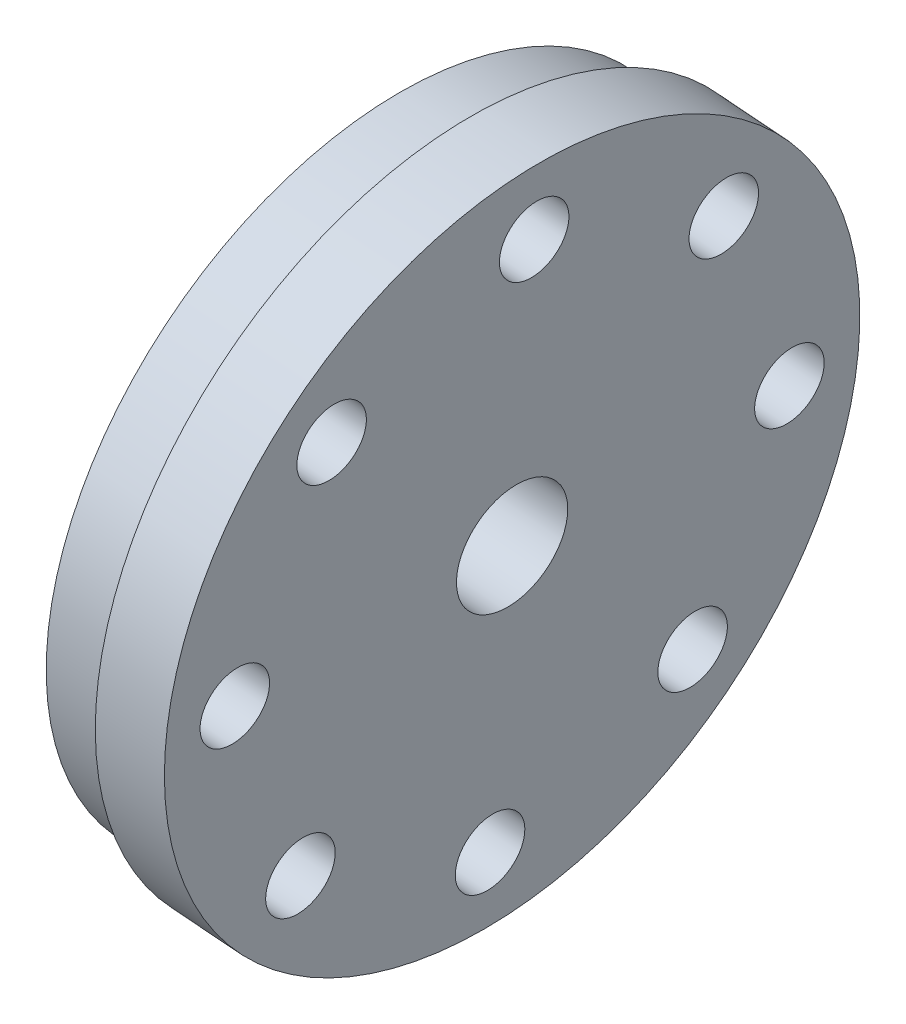
ISO-10303-21;
HEADER;
FILE_DESCRIPTION(('STEP AP214'),'2;1');
FILE_NAME('part.step','',(''),(''),'','','');
FILE_SCHEMA(('AUTOMOTIVE_DESIGN { 1 0 10303 214 1 1 1 1 }'));
ENDSEC;
DATA;
#1=APPLICATION_CONTEXT('core data for automotive mechanical design processes');
#2=APPLICATION_PROTOCOL_DEFINITION('international standard','automotive_design',2000,#1);
#3=PRODUCT_CONTEXT('',#1,'mechanical');
#4=PRODUCT('Part','Part','',(#3));
#5=PRODUCT_RELATED_PRODUCT_CATEGORY('part','',(#4));
#6=PRODUCT_DEFINITION_FORMATION('','',#4);
#7=PRODUCT_DEFINITION_CONTEXT('part definition',#1,'design');
#8=PRODUCT_DEFINITION('design','',#6,#7);
#9=PRODUCT_DEFINITION_SHAPE('','',#8);
#10=(LENGTH_UNIT() NAMED_UNIT(*) SI_UNIT(.MILLI.,.METRE.));
#11=(NAMED_UNIT(*) PLANE_ANGLE_UNIT() SI_UNIT($,.RADIAN.));
#12=(NAMED_UNIT(*) SI_UNIT($,.STERADIAN.) SOLID_ANGLE_UNIT());
#13=UNCERTAINTY_MEASURE_WITH_UNIT(LENGTH_MEASURE(1.E-05),#10,'distance_accuracy_value','');
#14=(GEOMETRIC_REPRESENTATION_CONTEXT(3) GLOBAL_UNCERTAINTY_ASSIGNED_CONTEXT((#13)) GLOBAL_UNIT_ASSIGNED_CONTEXT((#10,
#11,#12)) REPRESENTATION_CONTEXT('',''));
#15=CARTESIAN_POINT('',(0.,0.,0.));
#16=DIRECTION('',(0.,0.,1.));
#17=DIRECTION('',(1.,0.,0.));
#18=AXIS2_PLACEMENT_3D('',#15,#16,#17);
#19=CARTESIAN_POINT('',(228.628910451384,-9.66080811612064,43.174261814343));
#20=DIRECTION('',(0.996833274877087,-0.0795199477981641,0.));
#21=DIRECTION('',(0.0795199477981641,0.996833274877087,0.));
#22=AXIS2_PLACEMENT_3D('',#19,#20,#21);
#23=CYLINDRICAL_SURFACE('',#22,14.9606);
#24=CARTESIAN_POINT('',(231.793856099118,-9.91328395037981,43.174261814343));
#25=DIRECTION('',(-0.996833274877087,0.0795199477981641,0.));
#26=DIRECTION('',(-0.0795199477981641,-0.996833274877087,0.));
#27=AXIS2_PLACEMENT_3D('',#24,#25,#26);
#28=CIRCLE('',#27,14.9606);
#29=CARTESIAN_POINT('',(230.604189968089,-24.826507842506,43.174261814343));
#30=VERTEX_POINT('',#29);
#31=EDGE_CURVE('E10',#30,#30,#28,.F.);
#32=ORIENTED_EDGE('',*,*,#31,.F.);
#33=EDGE_LOOP('',(#32));
#34=FACE_BOUND('',#33,.T.);
#35=CARTESIAN_POINT('',(228.628910451384,-9.66080811612064,43.174261814343));
#36=DIRECTION('',(0.996833274877087,-0.0795199477981641,0.));
#37=DIRECTION('',(0.0795199477981641,0.996833274877087,0.));
#38=AXIS2_PLACEMENT_3D('',#35,#36,#37);
#39=CIRCLE('',#38,14.9606);
#40=CARTESIAN_POINT('',(229.818576582413,5.2524157760055,43.174261814343));
#41=VERTEX_POINT('',#40);
#42=EDGE_CURVE('E38',#41,#41,#39,.T.);
#43=ORIENTED_EDGE('',*,*,#42,.T.);
#44=EDGE_LOOP('',(#43));
#45=FACE_BOUND('',#44,.T.);
#46=ADVANCED_FACE('F32',(#34,#45),#23,.T.);
#47=CARTESIAN_POINT('',(228.628910451384,-9.66080811612064,43.174261814343));
#48=DIRECTION('',(0.996833274877087,-0.0795199477981641,0.));
#49=DIRECTION('',(0.0795199477981641,0.996833274877087,0.));
#50=AXIS2_PLACEMENT_3D('',#47,#48,#49);
#51=PLANE('',#50);
#52=CARTESIAN_POINT('',(228.628910451384,-9.66080811612098,30.4742618143433));
#53=DIRECTION('',(-0.996833274877087,0.0795199477981641,0.));
#54=DIRECTION('',(-0.0795199477981641,-0.996833274877087,0.));
#55=AXIS2_PLACEMENT_3D('',#52,#53,#54);
#56=CIRCLE('',#55,1.5875);
#57=CARTESIAN_POINT('',(228.502672534254,-11.2432809399884,30.4742618143433));
#58=VERTEX_POINT('',#57);
#59=EDGE_CURVE('E55',#58,#58,#56,.T.);
#60=ORIENTED_EDGE('',*,*,#59,.F.);
#61=EDGE_LOOP('',(#60));
#62=FACE_BOUND('',#61,.T.);
#63=CARTESIAN_POINT('',(229.343019949345,-0.708989997720514,34.1940056932739));
#64=DIRECTION('',(-0.996833274877087,0.0795199477981641,0.));
#65=DIRECTION('',(-0.0795199477981641,-0.996833274877087,0.));
#66=AXIS2_PLACEMENT_3D('',#63,#64,#65);
#67=CIRCLE('',#66,1.5875);
#68=CARTESIAN_POINT('',(229.216782032215,-2.29146282158789,34.1940056932739));
#69=VERTEX_POINT('',#68);
#70=EDGE_CURVE('E93',#69,#69,#67,.T.);
#71=ORIENTED_EDGE('',*,*,#70,.F.);
#72=EDGE_LOOP('',(#71));
#73=FACE_BOUND('',#72,.T.);
#74=CARTESIAN_POINT('',(227.914800953422,-18.6126262345212,34.1940056932744));
#75=DIRECTION('',(-0.996833274877087,0.0795199477981641,0.));
#76=DIRECTION('',(-0.0795199477981641,-0.996833274877087,0.));
#77=AXIS2_PLACEMENT_3D('',#74,#75,#76);
#78=CIRCLE('',#77,1.5875);
#79=CARTESIAN_POINT('',(227.788563036292,-20.1950990583886,34.1940056932744));
#80=VERTEX_POINT('',#79);
#81=EDGE_CURVE('E103',#80,#80,#78,.T.);
#82=ORIENTED_EDGE('',*,*,#81,.F.);
#83=EDGE_LOOP('',(#82));
#84=FACE_BOUND('',#83,.T.);
#85=CARTESIAN_POINT('',(227.619007114347,-22.3205907070596,43.1742618143437));
#86=DIRECTION('',(-0.996833274877087,0.0795199477981641,0.));
#87=DIRECTION('',(-0.0795199477981641,-0.996833274877087,0.));
#88=AXIS2_PLACEMENT_3D('',#85,#86,#87);
#89=CIRCLE('',#88,1.5875);
#90=CARTESIAN_POINT('',(227.492769197217,-23.903063530927,43.1742618143437));
#91=VERTEX_POINT('',#90);
#92=EDGE_CURVE('E99',#91,#91,#89,.T.);
#93=ORIENTED_EDGE('',*,*,#92,.F.);
#94=EDGE_LOOP('',(#93));
#95=FACE_BOUND('',#94,.T.);
#96=CARTESIAN_POINT('',(227.914800953422,-18.6126262345208,52.1545179354127));
#97=DIRECTION('',(-0.996833274877087,0.0795199477981641,0.));
#98=DIRECTION('',(-0.0795199477981641,-0.996833274877087,0.));
#99=AXIS2_PLACEMENT_3D('',#96,#97,#98);
#100=CIRCLE('',#99,1.5875);
#101=CARTESIAN_POINT('',(227.788563036292,-20.1950990583881,52.1545179354127));
#102=VERTEX_POINT('',#101);
#103=EDGE_CURVE('E102',#102,#102,#100,.T.);
#104=ORIENTED_EDGE('',*,*,#103,.F.);
#105=EDGE_LOOP('',(#104));
#106=FACE_BOUND('',#105,.T.);
#107=CARTESIAN_POINT('',(228.628910451384,-9.6608081161203,55.8742618143433));
#108=DIRECTION('',(-0.996833274877087,0.0795199477981641,0.));
#109=DIRECTION('',(-0.0795199477981641,-0.996833274877087,0.));
#110=AXIS2_PLACEMENT_3D('',#107,#108,#109);
#111=CIRCLE('',#110,1.5875);
#112=CARTESIAN_POINT('',(228.502672534254,-11.2432809399877,55.8742618143433));
#113=VERTEX_POINT('',#112);
#114=EDGE_CURVE('E113',#113,#113,#111,.T.);
#115=ORIENTED_EDGE('',*,*,#114,.F.);
#116=EDGE_LOOP('',(#115));
#117=FACE_BOUND('',#116,.T.);
#118=CARTESIAN_POINT('',(229.343019949345,-0.708989997720029,52.1545179354122));
#119=DIRECTION('',(-0.996833274877087,0.0795199477981641,0.));
#120=DIRECTION('',(-0.0795199477981641,-0.996833274877087,0.));
#121=AXIS2_PLACEMENT_3D('',#118,#119,#120);
#122=CIRCLE('',#121,1.5875);
#123=CARTESIAN_POINT('',(229.216782032216,-2.2914628215874,52.1545179354122));
#124=VERTEX_POINT('',#123);
#125=EDGE_CURVE('E110',#124,#124,#122,.T.);
#126=ORIENTED_EDGE('',*,*,#125,.F.);
#127=EDGE_LOOP('',(#126));
#128=FACE_BOUND('',#127,.T.);
#129=CARTESIAN_POINT('',(229.63881378842,2.99897447481836,43.174261814343));
#130=DIRECTION('',(-0.996833274877087,0.0795199477981641,0.));
#131=DIRECTION('',(-0.0795199477981641,-0.996833274877087,0.));
#132=AXIS2_PLACEMENT_3D('',#129,#130,#131);
#133=CIRCLE('',#132,1.5875);
#134=CARTESIAN_POINT('',(229.512575871291,1.41650165095099,43.174261814343));
#135=VERTEX_POINT('',#134);
#136=EDGE_CURVE('E98',#135,#135,#133,.T.);
#137=ORIENTED_EDGE('',*,*,#136,.F.);
#138=EDGE_LOOP('',(#137));
#139=FACE_BOUND('',#138,.T.);
#140=CARTESIAN_POINT('',(228.628910451384,-9.66080811612064,43.174261814343));
#141=DIRECTION('',(0.996833274877087,-0.0795199477981641,0.));
#142=DIRECTION('',(0.0795199477981641,0.996833274877087,0.));
#143=AXIS2_PLACEMENT_3D('',#140,#141,#142);
#144=CIRCLE('',#143,2.54);
#145=CARTESIAN_POINT('',(228.830891118791,-7.12885159793284,43.174261814343));
#146=VERTEX_POINT('',#145);
#147=EDGE_CURVE('E42',#146,#146,#144,.T.);
#148=ORIENTED_EDGE('',*,*,#147,.T.);
#149=EDGE_LOOP('',(#148));
#150=FACE_BOUND('',#149,.T.);
#151=ORIENTED_EDGE('',*,*,#42,.F.);
#152=EDGE_LOOP('',(#151));
#153=FACE_BOUND('',#152,.T.);
#154=ADVANCED_FACE('F84',(#62,#73,#84,#95,#106,#117,#128,#139,#150,#153),#51,.F.);
#155=CARTESIAN_POINT('',(234.958801746853,-10.165759784639,43.174261814343));
#156=DIRECTION('',(0.996833274877087,-0.0795199477981641,0.));
#157=DIRECTION('',(0.0795199477981641,0.996833274877087,0.));
#158=AXIS2_PLACEMENT_3D('',#155,#156,#157);
#159=PLANE('',#158);
#160=CARTESIAN_POINT('',(234.958801746853,-10.1657597846393,30.4742618143433));
#161=DIRECTION('',(0.996833274877087,-0.0795199477981641,0.));
#162=DIRECTION('',(0.0795199477981641,0.996833274877087,0.));
#163=AXIS2_PLACEMENT_3D('',#160,#161,#162);
#164=CIRCLE('',#163,1.5875);
#165=CARTESIAN_POINT('',(235.085039663983,-8.58328696077195,30.4742618143433));
#166=VERTEX_POINT('',#165);
#167=EDGE_CURVE('E72',#166,#166,#164,.T.);
#168=ORIENTED_EDGE('',*,*,#167,.F.);
#169=EDGE_LOOP('',(#168));
#170=FACE_BOUND('',#169,.T.);
#171=CARTESIAN_POINT('',(235.672911244815,-1.21394166623885,34.1940056932739));
#172=DIRECTION('',(0.996833274877087,-0.0795199477981641,0.));
#173=DIRECTION('',(0.0795199477981641,0.996833274877087,0.));
#174=AXIS2_PLACEMENT_3D('',#171,#172,#173);
#175=CIRCLE('',#174,1.5875);
#176=CARTESIAN_POINT('',(235.799149161944,0.368531157628521,34.1940056932739));
#177=VERTEX_POINT('',#176);
#178=EDGE_CURVE('E70',#177,#177,#175,.T.);
#179=ORIENTED_EDGE('',*,*,#178,.F.);
#180=EDGE_LOOP('',(#179));
#181=FACE_BOUND('',#180,.T.);
#182=CARTESIAN_POINT('',(234.244692248891,-19.1175779030396,34.1940056932744));
#183=DIRECTION('',(0.996833274877087,-0.0795199477981641,0.));
#184=DIRECTION('',(0.0795199477981641,0.996833274877087,0.));
#185=AXIS2_PLACEMENT_3D('',#182,#183,#184);
#186=CIRCLE('',#185,1.5875);
#187=CARTESIAN_POINT('',(234.370930166021,-17.5351050791722,34.1940056932744));
#188=VERTEX_POINT('',#187);
#189=EDGE_CURVE('E67',#188,#188,#186,.T.);
#190=ORIENTED_EDGE('',*,*,#189,.F.);
#191=EDGE_LOOP('',(#190));
#192=FACE_BOUND('',#191,.T.);
#193=CARTESIAN_POINT('',(233.948898409816,-22.825542375578,43.1742618143437));
#194=DIRECTION('',(0.996833274877087,-0.0795199477981641,0.));
#195=DIRECTION('',(0.0795199477981641,0.996833274877087,0.));
#196=AXIS2_PLACEMENT_3D('',#193,#194,#195);
#197=CIRCLE('',#196,1.5875);
#198=CARTESIAN_POINT('',(234.075136326946,-21.2430695517106,43.1742618143437));
#199=VERTEX_POINT('',#198);
#200=EDGE_CURVE('E64',#199,#199,#197,.T.);
#201=ORIENTED_EDGE('',*,*,#200,.F.);
#202=EDGE_LOOP('',(#201));
#203=FACE_BOUND('',#202,.T.);
#204=CARTESIAN_POINT('',(234.244692248891,-19.1175779030391,52.1545179354127));
#205=DIRECTION('',(0.996833274877087,-0.0795199477981641,0.));
#206=DIRECTION('',(0.0795199477981641,0.996833274877087,0.));
#207=AXIS2_PLACEMENT_3D('',#204,#205,#206);
#208=CIRCLE('',#207,1.5875);
#209=CARTESIAN_POINT('',(234.370930166021,-17.5351050791717,52.1545179354127));
#210=VERTEX_POINT('',#209);
#211=EDGE_CURVE('E61',#210,#210,#208,.T.);
#212=ORIENTED_EDGE('',*,*,#211,.F.);
#213=EDGE_LOOP('',(#212));
#214=FACE_BOUND('',#213,.T.);
#215=CARTESIAN_POINT('',(234.958801746853,-10.1657597846386,55.8742618143433));
#216=DIRECTION('',(0.996833274877087,-0.0795199477981641,0.));
#217=DIRECTION('',(0.0795199477981641,0.996833274877087,0.));
#218=AXIS2_PLACEMENT_3D('',#215,#216,#217);
#219=CIRCLE('',#218,1.5875);
#220=CARTESIAN_POINT('',(235.085039663983,-8.58328696077126,55.8742618143433));
#221=VERTEX_POINT('',#220);
#222=EDGE_CURVE('E58',#221,#221,#219,.T.);
#223=ORIENTED_EDGE('',*,*,#222,.F.);
#224=EDGE_LOOP('',(#223));
#225=FACE_BOUND('',#224,.T.);
#226=CARTESIAN_POINT('',(235.672911244815,-1.21394166623837,52.1545179354122));
#227=DIRECTION('',(0.996833274877087,-0.0795199477981641,0.));
#228=DIRECTION('',(0.0795199477981641,0.996833274877087,0.));
#229=AXIS2_PLACEMENT_3D('',#226,#227,#228);
#230=CIRCLE('',#229,1.5875);
#231=CARTESIAN_POINT('',(235.799149161944,0.368531157629007,52.1545179354122));
#232=VERTEX_POINT('',#231);
#233=EDGE_CURVE('E54',#232,#232,#230,.T.);
#234=ORIENTED_EDGE('',*,*,#233,.F.);
#235=EDGE_LOOP('',(#234));
#236=FACE_BOUND('',#235,.T.);
#237=CARTESIAN_POINT('',(235.96870508389,2.49402280630002,43.174261814343));
#238=DIRECTION('',(0.996833274877087,-0.0795199477981641,0.));
#239=DIRECTION('',(0.0795199477981641,0.996833274877087,0.));
#240=AXIS2_PLACEMENT_3D('',#237,#238,#239);
#241=CIRCLE('',#240,1.5875);
#242=CARTESIAN_POINT('',(236.094943001019,4.0764956301674,43.174261814343));
#243=VERTEX_POINT('',#242);
#244=EDGE_CURVE('E51',#243,#243,#241,.T.);
#245=ORIENTED_EDGE('',*,*,#244,.F.);
#246=EDGE_LOOP('',(#245));
#247=FACE_BOUND('',#246,.T.);
#248=CARTESIAN_POINT('',(234.958801746853,-10.165759784639,43.174261814343));
#249=DIRECTION('',(0.996833274877087,-0.0795199477981641,0.));
#250=DIRECTION('',(0.0795199477981641,0.996833274877087,0.));
#251=AXIS2_PLACEMENT_3D('',#248,#249,#250);
#252=CIRCLE('',#251,2.54);
#253=CARTESIAN_POINT('',(235.16078241426,-7.63380326645118,43.174261814343));
#254=VERTEX_POINT('',#253);
#255=EDGE_CURVE('E47',#254,#254,#252,.T.);
#256=ORIENTED_EDGE('',*,*,#255,.F.);
#257=EDGE_LOOP('',(#256));
#258=FACE_BOUND('',#257,.T.);
#259=CARTESIAN_POINT('',(234.958801746853,-10.165759784639,43.174261814343));
#260=DIRECTION('',(-0.996833274877087,0.0795199477981641,0.));
#261=DIRECTION('',(-0.0795199477981641,-0.996833274877087,0.));
#262=AXIS2_PLACEMENT_3D('',#259,#260,#261);
#263=CIRCLE('',#262,15.875);
#264=CARTESIAN_POINT('',(233.696422575557,-25.9904880233127,43.174261814343));
#265=VERTEX_POINT('',#264);
#266=EDGE_CURVE('E88',#265,#265,#263,.T.);
#267=ORIENTED_EDGE('',*,*,#266,.F.);
#268=EDGE_LOOP('',(#267));
#269=FACE_BOUND('',#268,.T.);
#270=ADVANCED_FACE('F81',(#170,#181,#192,#203,#214,#225,#236,#247,#258,#269),#159,.T.);
#271=CARTESIAN_POINT('',(228.628910451384,-9.66080811612064,43.174261814343));
#272=DIRECTION('',(0.996833274877087,-0.0795199477981641,0.));
#273=DIRECTION('',(0.0795199477981641,0.996833274877087,0.));
#274=AXIS2_PLACEMENT_3D('',#271,#272,#273);
#275=CYLINDRICAL_SURFACE('',#274,2.54);
#276=ORIENTED_EDGE('',*,*,#147,.F.);
#277=EDGE_LOOP('',(#276));
#278=FACE_BOUND('',#277,.T.);
#279=ORIENTED_EDGE('',*,*,#255,.T.);
#280=EDGE_LOOP('',(#279));
#281=FACE_BOUND('',#280,.T.);
#282=ADVANCED_FACE('F79',(#278,#281),#275,.F.);
#283=CARTESIAN_POINT('',(239.607146537191,2.20377499683672,43.174261814343));
#284=DIRECTION('',(-0.996833274877087,0.0795199477981641,0.));
#285=DIRECTION('',(-0.0795199477981641,-0.996833274877087,0.));
#286=AXIS2_PLACEMENT_3D('',#283,#284,#285);
#287=CYLINDRICAL_SURFACE('',#286,1.5875);
#288=ORIENTED_EDGE('',*,*,#244,.T.);
#289=EDGE_LOOP('',(#288));
#290=FACE_BOUND('',#289,.T.);
#291=ORIENTED_EDGE('',*,*,#136,.T.);
#292=EDGE_LOOP('',(#291));
#293=FACE_BOUND('',#292,.T.);
#294=ADVANCED_FACE('F135',(#290,#293),#287,.F.);
#295=CARTESIAN_POINT('',(239.311352698116,-1.50418947570167,52.1545179354122));
#296=DIRECTION('',(-0.996833274877087,0.0795199477981641,0.));
#297=DIRECTION('',(-0.0795199477981641,-0.996833274877087,0.));
#298=AXIS2_PLACEMENT_3D('',#295,#296,#297);
#299=CYLINDRICAL_SURFACE('',#298,1.5875);
#300=ORIENTED_EDGE('',*,*,#233,.T.);
#301=EDGE_LOOP('',(#300));
#302=FACE_BOUND('',#301,.T.);
#303=ORIENTED_EDGE('',*,*,#125,.T.);
#304=EDGE_LOOP('',(#303));
#305=FACE_BOUND('',#304,.T.);
#306=ADVANCED_FACE('F140',(#302,#305),#299,.F.);
#307=CARTESIAN_POINT('',(238.597243200154,-10.4560075941019,55.8742618143433));
#308=DIRECTION('',(-0.996833274877087,0.0795199477981641,0.));
#309=DIRECTION('',(-0.0795199477981641,-0.996833274877087,0.));
#310=AXIS2_PLACEMENT_3D('',#307,#308,#309);
#311=CYLINDRICAL_SURFACE('',#310,1.5875);
#312=ORIENTED_EDGE('',*,*,#222,.T.);
#313=EDGE_LOOP('',(#312));
#314=FACE_BOUND('',#313,.T.);
#315=ORIENTED_EDGE('',*,*,#114,.T.);
#316=EDGE_LOOP('',(#315));
#317=FACE_BOUND('',#316,.T.);
#318=ADVANCED_FACE('F204',(#314,#317),#311,.F.);
#319=CARTESIAN_POINT('',(237.883133702193,-19.4078257125024,52.1545179354127));
#320=DIRECTION('',(-0.996833274877087,0.0795199477981641,0.));
#321=DIRECTION('',(-0.0795199477981641,-0.996833274877087,0.));
#322=AXIS2_PLACEMENT_3D('',#319,#320,#321);
#323=CYLINDRICAL_SURFACE('',#322,1.5875);
#324=ORIENTED_EDGE('',*,*,#211,.T.);
#325=EDGE_LOOP('',(#324));
#326=FACE_BOUND('',#325,.T.);
#327=ORIENTED_EDGE('',*,*,#103,.T.);
#328=EDGE_LOOP('',(#327));
#329=FACE_BOUND('',#328,.T.);
#330=ADVANCED_FACE('F119',(#326,#329),#323,.F.);
#331=CARTESIAN_POINT('',(237.587339863118,-23.1157901850413,43.1742618143437));
#332=DIRECTION('',(-0.996833274877087,0.0795199477981641,0.));
#333=DIRECTION('',(-0.0795199477981641,-0.996833274877087,0.));
#334=AXIS2_PLACEMENT_3D('',#331,#332,#333);
#335=CYLINDRICAL_SURFACE('',#334,1.5875);
#336=ORIENTED_EDGE('',*,*,#200,.T.);
#337=EDGE_LOOP('',(#336));
#338=FACE_BOUND('',#337,.T.);
#339=ORIENTED_EDGE('',*,*,#92,.T.);
#340=EDGE_LOOP('',(#339));
#341=FACE_BOUND('',#340,.T.);
#342=ADVANCED_FACE('F191',(#338,#341),#335,.F.);
#343=CARTESIAN_POINT('',(237.883133702193,-19.4078257125029,34.1940056932744));
#344=DIRECTION('',(-0.996833274877087,0.0795199477981641,0.));
#345=DIRECTION('',(-0.0795199477981641,-0.996833274877087,0.));
#346=AXIS2_PLACEMENT_3D('',#343,#344,#345);
#347=CYLINDRICAL_SURFACE('',#346,1.5875);
#348=ORIENTED_EDGE('',*,*,#189,.T.);
#349=EDGE_LOOP('',(#348));
#350=FACE_BOUND('',#349,.T.);
#351=ORIENTED_EDGE('',*,*,#81,.T.);
#352=EDGE_LOOP('',(#351));
#353=FACE_BOUND('',#352,.T.);
#354=ADVANCED_FACE('F194',(#350,#353),#347,.F.);
#355=CARTESIAN_POINT('',(239.311352698116,-1.50418947570216,34.1940056932739));
#356=DIRECTION('',(-0.996833274877087,0.0795199477981641,0.));
#357=DIRECTION('',(-0.0795199477981641,-0.996833274877087,0.));
#358=AXIS2_PLACEMENT_3D('',#355,#356,#357);
#359=CYLINDRICAL_SURFACE('',#358,1.5875);
#360=ORIENTED_EDGE('',*,*,#178,.T.);
#361=EDGE_LOOP('',(#360));
#362=FACE_BOUND('',#361,.T.);
#363=ORIENTED_EDGE('',*,*,#70,.T.);
#364=EDGE_LOOP('',(#363));
#365=FACE_BOUND('',#364,.T.);
#366=ADVANCED_FACE('F190',(#362,#365),#359,.F.);
#367=CARTESIAN_POINT('',(238.597243200154,-10.4560075941026,30.4742618143433));
#368=DIRECTION('',(-0.996833274877087,0.0795199477981641,0.));
#369=DIRECTION('',(-0.0795199477981641,-0.996833274877087,0.));
#370=AXIS2_PLACEMENT_3D('',#367,#368,#369);
#371=CYLINDRICAL_SURFACE('',#370,1.5875);
#372=ORIENTED_EDGE('',*,*,#167,.T.);
#373=EDGE_LOOP('',(#372));
#374=FACE_BOUND('',#373,.T.);
#375=ORIENTED_EDGE('',*,*,#59,.T.);
#376=EDGE_LOOP('',(#375));
#377=FACE_BOUND('',#376,.T.);
#378=ADVANCED_FACE('F172',(#374,#377),#371,.F.);
#379=CARTESIAN_POINT('',(231.793856099118,-9.91328395037981,43.174261814343));
#380=DIRECTION('',(-0.996833274877087,0.0795199477981641,0.));
#381=DIRECTION('',(-0.0795199477981641,-0.996833274877087,0.));
#382=AXIS2_PLACEMENT_3D('',#379,#380,#381);
#383=PLANE('',#382);
#384=CARTESIAN_POINT('',(231.793856099118,-9.91328395037981,43.174261814343));
#385=DIRECTION('',(-0.996833274877087,0.0795199477981641,0.));
#386=DIRECTION('',(-0.0795199477981641,-0.996833274877087,0.));
#387=AXIS2_PLACEMENT_3D('',#384,#385,#386);
#388=CIRCLE('',#387,15.875);
#389=CARTESIAN_POINT('',(230.531476927822,-25.7380121890536,43.174261814343));
#390=VERTEX_POINT('',#389);
#391=EDGE_CURVE('E90',#390,#390,#388,.T.);
#392=ORIENTED_EDGE('',*,*,#391,.T.);
#393=EDGE_LOOP('',(#392));
#394=FACE_BOUND('',#393,.T.);
#395=ORIENTED_EDGE('',*,*,#31,.T.);
#396=EDGE_LOOP('',(#395));
#397=FACE_BOUND('',#396,.T.);
#398=ADVANCED_FACE('F167',(#394,#397),#383,.T.);
#399=CARTESIAN_POINT('',(231.793856099118,-9.91328395037981,43.174261814343));
#400=DIRECTION('',(0.996833274877087,-0.0795199477981641,0.));
#401=DIRECTION('',(0.0795199477981641,0.996833274877087,0.));
#402=AXIS2_PLACEMENT_3D('',#399,#400,#401);
#403=CYLINDRICAL_SURFACE('',#402,15.875);
#404=ORIENTED_EDGE('',*,*,#391,.F.);
#405=EDGE_LOOP('',(#404));
#406=FACE_BOUND('',#405,.T.);
#407=ORIENTED_EDGE('',*,*,#266,.T.);
#408=EDGE_LOOP('',(#407));
#409=FACE_BOUND('',#408,.T.);
#410=ADVANCED_FACE('F171',(#406,#409),#403,.T.);
#411=CLOSED_SHELL('',(#46,#154,#270,#282,#294,#306,#318,#330,#342,#354,#366,#378,#398,#410));
#412=MANIFOLD_SOLID_BREP('B2',#411);
#413=ADVANCED_BREP_SHAPE_REPRESENTATION('',(#18,#412),#14);
#414=SHAPE_DEFINITION_REPRESENTATION(#9,#413);
ENDSEC;
END-ISO-10303-21;
